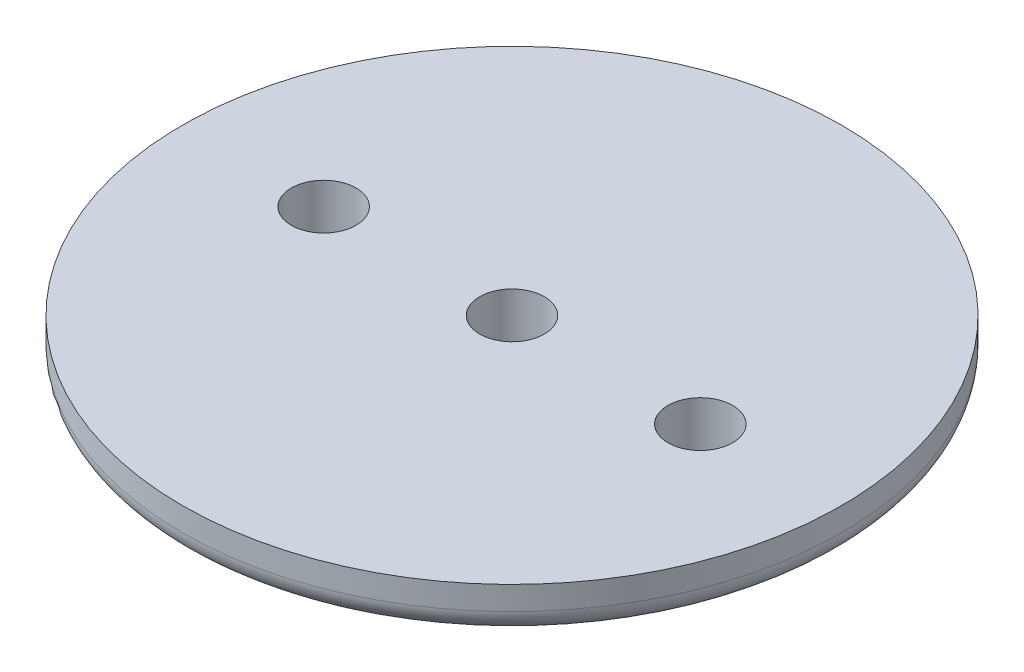
ISO-10303-21;
HEADER;
FILE_DESCRIPTION(('STEP AP214'),'2;1');
FILE_NAME('part.step','',(''),(''),'','','');
FILE_SCHEMA(('AUTOMOTIVE_DESIGN { 1 0 10303 214 1 1 1 1 }'));
ENDSEC;
DATA;
#1=APPLICATION_CONTEXT('core data for automotive mechanical design processes');
#2=APPLICATION_PROTOCOL_DEFINITION('international standard','automotive_design',2000,#1);
#3=PRODUCT_CONTEXT('',#1,'mechanical');
#4=PRODUCT('Part','Part','',(#3));
#5=PRODUCT_RELATED_PRODUCT_CATEGORY('part','',(#4));
#6=PRODUCT_DEFINITION_FORMATION('','',#4);
#7=PRODUCT_DEFINITION_CONTEXT('part definition',#1,'design');
#8=PRODUCT_DEFINITION('design','',#6,#7);
#9=PRODUCT_DEFINITION_SHAPE('','',#8);
#10=(LENGTH_UNIT() NAMED_UNIT(*) SI_UNIT(.MILLI.,.METRE.));
#11=(NAMED_UNIT(*) PLANE_ANGLE_UNIT() SI_UNIT($,.RADIAN.));
#12=(NAMED_UNIT(*) SI_UNIT($,.STERADIAN.) SOLID_ANGLE_UNIT());
#13=UNCERTAINTY_MEASURE_WITH_UNIT(LENGTH_MEASURE(1.E-05),#10,'distance_accuracy_value','');
#14=(GEOMETRIC_REPRESENTATION_CONTEXT(3) GLOBAL_UNCERTAINTY_ASSIGNED_CONTEXT((#13)) GLOBAL_UNIT_ASSIGNED_CONTEXT((#10,
#11,#12)) REPRESENTATION_CONTEXT('',''));
#15=CARTESIAN_POINT('',(0.,0.,0.));
#16=DIRECTION('',(0.,0.,1.));
#17=DIRECTION('',(1.,0.,0.));
#18=AXIS2_PLACEMENT_3D('',#15,#16,#17);
#19=CARTESIAN_POINT('',(0.,0.,0.));
#20=DIRECTION('',(0.,-1.,0.));
#21=DIRECTION('',(0.,0.,-1.));
#22=AXIS2_PLACEMENT_3D('',#19,#20,#21);
#23=PLANE('',#22);
#24=CARTESIAN_POINT('',(-12.7,0.,0.));
#25=DIRECTION('',(0.,1.,0.));
#26=DIRECTION('',(0.,0.,1.));
#27=AXIS2_PLACEMENT_3D('',#24,#25,#26);
#28=CIRCLE('',#27,2.1828125);
#29=CARTESIAN_POINT('',(-12.7,0.,2.1828125));
#30=VERTEX_POINT('',#29);
#31=EDGE_CURVE('E77',#30,#30,#28,.T.);
#32=ORIENTED_EDGE('',*,*,#31,.T.);
#33=EDGE_LOOP('',(#32));
#34=FACE_BOUND('',#33,.T.);
#35=CARTESIAN_POINT('',(12.7,0.,0.));
#36=DIRECTION('',(0.,1.,0.));
#37=DIRECTION('',(0.,0.,1.));
#38=AXIS2_PLACEMENT_3D('',#35,#36,#37);
#39=CIRCLE('',#38,2.1828125);
#40=CARTESIAN_POINT('',(12.7,0.,2.1828125));
#41=VERTEX_POINT('',#40);
#42=EDGE_CURVE('E76',#41,#41,#39,.T.);
#43=ORIENTED_EDGE('',*,*,#42,.T.);
#44=EDGE_LOOP('',(#43));
#45=FACE_BOUND('',#44,.T.);
#46=CARTESIAN_POINT('',(0.,0.,0.));
#47=DIRECTION('',(0.,1.,0.));
#48=DIRECTION('',(0.,0.,1.));
#49=AXIS2_PLACEMENT_3D('',#46,#47,#48);
#50=CIRCLE('',#49,2.1828125);
#51=CARTESIAN_POINT('',(0.,0.,2.1828125));
#52=VERTEX_POINT('',#51);
#53=EDGE_CURVE('E59',#52,#52,#50,.T.);
#54=ORIENTED_EDGE('',*,*,#53,.T.);
#55=EDGE_LOOP('',(#54));
#56=FACE_BOUND('',#55,.T.);
#57=CARTESIAN_POINT('',(0.,0.,0.));
#58=DIRECTION('',(0.,-1.,0.));
#59=DIRECTION('',(0.,0.,-1.));
#60=AXIS2_PLACEMENT_3D('',#57,#58,#59);
#61=CIRCLE('',#60,20.6375);
#62=CARTESIAN_POINT('',(0.,0.,-20.6375));
#63=VERTEX_POINT('',#62);
#64=EDGE_CURVE('E10',#63,#63,#61,.T.);
#65=ORIENTED_EDGE('',*,*,#64,.T.);
#66=EDGE_LOOP('',(#65));
#67=FACE_BOUND('',#66,.T.);
#68=ADVANCED_FACE('F37',(#34,#45,#56,#67),#23,.T.);
#69=CARTESIAN_POINT('',(0.,1.5875,0.));
#70=DIRECTION('',(0.,-1.,0.));
#71=DIRECTION('',(0.,0.,-1.));
#72=AXIS2_PLACEMENT_3D('',#69,#70,#71);
#73=TOROIDAL_SURFACE('',#72,20.6375,1.5875);
#74=CARTESIAN_POINT('',(0.,1.5875,0.));
#75=DIRECTION('',(0.,-1.,0.));
#76=DIRECTION('',(0.,0.,-1.));
#77=AXIS2_PLACEMENT_3D('',#74,#75,#76);
#78=CIRCLE('',#77,22.225);
#79=CARTESIAN_POINT('',(0.,1.5875,-22.225));
#80=VERTEX_POINT('',#79);
#81=EDGE_CURVE('E45',#80,#80,#78,.T.);
#82=ORIENTED_EDGE('',*,*,#81,.T.);
#83=EDGE_LOOP('',(#82));
#84=FACE_BOUND('',#83,.T.);
#85=ORIENTED_EDGE('',*,*,#64,.F.);
#86=EDGE_LOOP('',(#85));
#87=FACE_BOUND('',#86,.T.);
#88=ADVANCED_FACE('F101',(#84,#87),#73,.T.);
#89=CARTESIAN_POINT('',(0.,0.,0.));
#90=DIRECTION('',(0.,-1.,0.));
#91=DIRECTION('',(0.,0.,-1.));
#92=AXIS2_PLACEMENT_3D('',#89,#90,#91);
#93=CYLINDRICAL_SURFACE('',#92,22.225);
#94=CARTESIAN_POINT('',(0.,3.175,0.));
#95=DIRECTION('',(0.,-1.,0.));
#96=DIRECTION('',(0.,0.,-1.));
#97=AXIS2_PLACEMENT_3D('',#94,#95,#96);
#98=CIRCLE('',#97,22.225);
#99=CARTESIAN_POINT('',(0.,3.175,-22.225));
#100=VERTEX_POINT('',#99);
#101=EDGE_CURVE('E51',#100,#100,#98,.T.);
#102=ORIENTED_EDGE('',*,*,#101,.T.);
#103=EDGE_LOOP('',(#102));
#104=FACE_BOUND('',#103,.T.);
#105=ORIENTED_EDGE('',*,*,#81,.F.);
#106=EDGE_LOOP('',(#105));
#107=FACE_BOUND('',#106,.T.);
#108=ADVANCED_FACE('F106',(#104,#107),#93,.T.);
#109=CARTESIAN_POINT('',(0.,3.175,0.));
#110=DIRECTION('',(0.,1.,0.));
#111=DIRECTION('',(0.,0.,1.));
#112=AXIS2_PLACEMENT_3D('',#109,#110,#111);
#113=PLANE('',#112);
#114=CARTESIAN_POINT('',(-12.7,3.175,0.));
#115=DIRECTION('',(0.,1.,0.));
#116=DIRECTION('',(0.,0.,1.));
#117=AXIS2_PLACEMENT_3D('',#114,#115,#116);
#118=CIRCLE('',#117,2.1828125);
#119=CARTESIAN_POINT('',(-12.7,3.175,2.1828125));
#120=VERTEX_POINT('',#119);
#121=EDGE_CURVE('E40',#120,#120,#118,.T.);
#122=ORIENTED_EDGE('',*,*,#121,.F.);
#123=EDGE_LOOP('',(#122));
#124=FACE_BOUND('',#123,.T.);
#125=CARTESIAN_POINT('',(12.7,3.175,0.));
#126=DIRECTION('',(0.,1.,0.));
#127=DIRECTION('',(0.,0.,1.));
#128=AXIS2_PLACEMENT_3D('',#125,#126,#127);
#129=CIRCLE('',#128,2.1828125);
#130=CARTESIAN_POINT('',(12.7,3.175,2.1828125));
#131=VERTEX_POINT('',#130);
#132=EDGE_CURVE('E58',#131,#131,#129,.T.);
#133=ORIENTED_EDGE('',*,*,#132,.F.);
#134=EDGE_LOOP('',(#133));
#135=FACE_BOUND('',#134,.T.);
#136=CARTESIAN_POINT('',(0.,3.175,0.));
#137=DIRECTION('',(0.,1.,0.));
#138=DIRECTION('',(0.,0.,1.));
#139=AXIS2_PLACEMENT_3D('',#136,#137,#138);
#140=CIRCLE('',#139,2.1828125);
#141=CARTESIAN_POINT('',(0.,3.175,2.1828125));
#142=VERTEX_POINT('',#141);
#143=EDGE_CURVE('E55',#142,#142,#140,.T.);
#144=ORIENTED_EDGE('',*,*,#143,.F.);
#145=EDGE_LOOP('',(#144));
#146=FACE_BOUND('',#145,.T.);
#147=ORIENTED_EDGE('',*,*,#101,.F.);
#148=EDGE_LOOP('',(#147));
#149=FACE_BOUND('',#148,.T.);
#150=ADVANCED_FACE('F97',(#124,#135,#146,#149),#113,.T.);
#151=CARTESIAN_POINT('',(0.,0.,0.));
#152=DIRECTION('',(0.,1.,0.));
#153=DIRECTION('',(0.,0.,1.));
#154=AXIS2_PLACEMENT_3D('',#151,#152,#153);
#155=CYLINDRICAL_SURFACE('',#154,2.1828125);
#156=ORIENTED_EDGE('',*,*,#143,.T.);
#157=EDGE_LOOP('',(#156));
#158=FACE_BOUND('',#157,.T.);
#159=ORIENTED_EDGE('',*,*,#53,.F.);
#160=EDGE_LOOP('',(#159));
#161=FACE_BOUND('',#160,.T.);
#162=ADVANCED_FACE('F90',(#158,#161),#155,.F.);
#163=CARTESIAN_POINT('',(12.7,0.,0.));
#164=DIRECTION('',(0.,1.,0.));
#165=DIRECTION('',(0.,0.,1.));
#166=AXIS2_PLACEMENT_3D('',#163,#164,#165);
#167=CYLINDRICAL_SURFACE('',#166,2.1828125);
#168=ORIENTED_EDGE('',*,*,#132,.T.);
#169=EDGE_LOOP('',(#168));
#170=FACE_BOUND('',#169,.T.);
#171=ORIENTED_EDGE('',*,*,#42,.F.);
#172=EDGE_LOOP('',(#171));
#173=FACE_BOUND('',#172,.T.);
#174=ADVANCED_FACE('F87',(#170,#173),#167,.F.);
#175=CARTESIAN_POINT('',(-12.7,0.,0.));
#176=DIRECTION('',(0.,1.,0.));
#177=DIRECTION('',(0.,0.,1.));
#178=AXIS2_PLACEMENT_3D('',#175,#176,#177);
#179=CYLINDRICAL_SURFACE('',#178,2.1828125);
#180=ORIENTED_EDGE('',*,*,#121,.T.);
#181=EDGE_LOOP('',(#180));
#182=FACE_BOUND('',#181,.T.);
#183=ORIENTED_EDGE('',*,*,#31,.F.);
#184=EDGE_LOOP('',(#183));
#185=FACE_BOUND('',#184,.T.);
#186=ADVANCED_FACE('F89',(#182,#185),#179,.F.);
#187=CLOSED_SHELL('',(#68,#88,#108,#150,#162,#174,#186));
#188=MANIFOLD_SOLID_BREP('B2',#187);
#189=ADVANCED_BREP_SHAPE_REPRESENTATION('',(#18,#188),#14);
#190=SHAPE_DEFINITION_REPRESENTATION(#9,#189);
ENDSEC;
END-ISO-10303-21;
